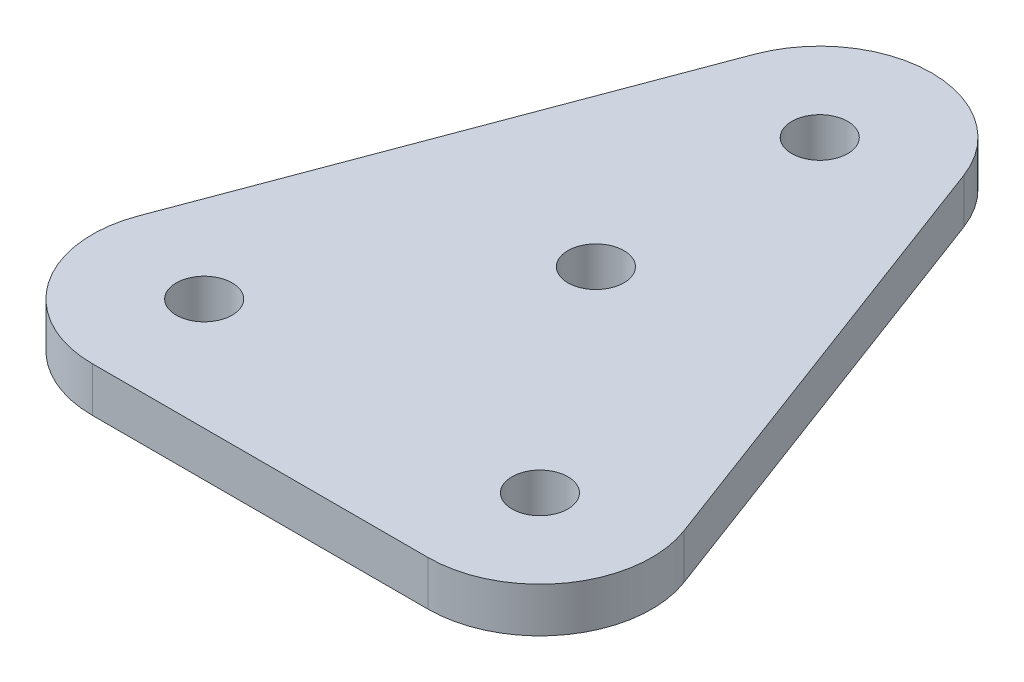
ISO-10303-21;
HEADER;
FILE_DESCRIPTION(('STEP AP214'),'2;1');
FILE_NAME('part.step','',(''),(''),'','','');
FILE_SCHEMA(('AUTOMOTIVE_DESIGN { 1 0 10303 214 1 1 1 1 }'));
ENDSEC;
DATA;
#1=APPLICATION_CONTEXT('core data for automotive mechanical design processes');
#2=APPLICATION_PROTOCOL_DEFINITION('international standard','automotive_design',2000,#1);
#3=PRODUCT_CONTEXT('',#1,'mechanical');
#4=PRODUCT('Part','Part','',(#3));
#5=PRODUCT_RELATED_PRODUCT_CATEGORY('part','',(#4));
#6=PRODUCT_DEFINITION_FORMATION('','',#4);
#7=PRODUCT_DEFINITION_CONTEXT('part definition',#1,'design');
#8=PRODUCT_DEFINITION('design','',#6,#7);
#9=PRODUCT_DEFINITION_SHAPE('','',#8);
#10=(LENGTH_UNIT() NAMED_UNIT(*) SI_UNIT(.MILLI.,.METRE.));
#11=(NAMED_UNIT(*) PLANE_ANGLE_UNIT() SI_UNIT($,.RADIAN.));
#12=(NAMED_UNIT(*) SI_UNIT($,.STERADIAN.) SOLID_ANGLE_UNIT());
#13=UNCERTAINTY_MEASURE_WITH_UNIT(LENGTH_MEASURE(1.E-05),#10,'distance_accuracy_value','');
#14=(GEOMETRIC_REPRESENTATION_CONTEXT(3) GLOBAL_UNCERTAINTY_ASSIGNED_CONTEXT((#13)) GLOBAL_UNIT_ASSIGNED_CONTEXT((#10,
#11,#12)) REPRESENTATION_CONTEXT('',''));
#15=CARTESIAN_POINT('',(0.,0.,0.));
#16=DIRECTION('',(0.,0.,1.));
#17=DIRECTION('',(1.,0.,0.));
#18=AXIS2_PLACEMENT_3D('',#15,#16,#17);
#19=CARTESIAN_POINT('',(-15.,4.,0.));
#20=DIRECTION('',(0.,1.,0.));
#21=DIRECTION('',(0.,0.,1.));
#22=AXIS2_PLACEMENT_3D('',#19,#20,#21);
#23=PLANE('',#22);
#24=CARTESIAN_POINT('',(0.,4.,-20.));
#25=DIRECTION('',(0.,1.,0.));
#26=DIRECTION('',(0.,0.,1.));
#27=AXIS2_PLACEMENT_3D('',#24,#25,#26);
#28=CIRCLE('',#27,2.5);
#29=CARTESIAN_POINT('',(0.,4.,-17.5));
#30=VERTEX_POINT('',#29);
#31=EDGE_CURVE('E190',#30,#30,#28,.T.);
#32=ORIENTED_EDGE('',*,*,#31,.F.);
#33=EDGE_LOOP('',(#32));
#34=FACE_BOUND('',#33,.T.);
#35=CARTESIAN_POINT('',(15.,4.,0.));
#36=DIRECTION('',(0.,1.,0.));
#37=DIRECTION('',(0.,0.,1.));
#38=AXIS2_PLACEMENT_3D('',#35,#36,#37);
#39=CIRCLE('',#38,2.5);
#40=CARTESIAN_POINT('',(15.,4.,2.5));
#41=VERTEX_POINT('',#40);
#42=EDGE_CURVE('E123',#41,#41,#39,.T.);
#43=ORIENTED_EDGE('',*,*,#42,.F.);
#44=EDGE_LOOP('',(#43));
#45=FACE_BOUND('',#44,.T.);
#46=CARTESIAN_POINT('',(-15.,4.,0.));
#47=DIRECTION('',(0.,1.,0.));
#48=DIRECTION('',(0.,0.,1.));
#49=AXIS2_PLACEMENT_3D('',#46,#47,#48);
#50=CIRCLE('',#49,9.99999999999999);
#51=CARTESIAN_POINT('',(-24.3632917756904,4.,-3.51123441588391));
#52=VERTEX_POINT('',#51);
#53=CARTESIAN_POINT('',(-15.,4.,10.));
#54=VERTEX_POINT('',#53);
#55=EDGE_CURVE('E130',#52,#54,#50,.T.);
#56=ORIENTED_EDGE('',*,*,#55,.T.);
#57=DIRECTION('',(1.,0.,0.));
#58=VECTOR('',#57,1.);
#59=CARTESIAN_POINT('',(-15.,4.,10.));
#60=LINE('',#59,#58);
#61=CARTESIAN_POINT('',(15.,4.,10.));
#62=VERTEX_POINT('',#61);
#63=EDGE_CURVE('E88',#54,#62,#60,.T.);
#64=ORIENTED_EDGE('',*,*,#63,.T.);
#65=CARTESIAN_POINT('',(15.,4.,0.));
#66=DIRECTION('',(0.,1.,0.));
#67=DIRECTION('',(0.,0.,1.));
#68=AXIS2_PLACEMENT_3D('',#65,#66,#67);
#69=CIRCLE('',#68,9.99999999999999);
#70=CARTESIAN_POINT('',(24.3632917756904,4.,-3.51123441588392));
#71=VERTEX_POINT('',#70);
#72=EDGE_CURVE('E101',#62,#71,#69,.T.);
#73=ORIENTED_EDGE('',*,*,#72,.T.);
#74=DIRECTION('',(-0.351123441588392,0.,-0.936329177569045));
#75=VECTOR('',#74,1.);
#76=CARTESIAN_POINT('',(9.36329177569044,4.,-43.5112344158839));
#77=LINE('',#76,#75);
#78=CARTESIAN_POINT('',(9.36329177569044,4.,-43.5112344158839));
#79=VERTEX_POINT('',#78);
#80=EDGE_CURVE('E95',#71,#79,#77,.T.);
#81=ORIENTED_EDGE('',*,*,#80,.T.);
#82=CARTESIAN_POINT('',(0.,4.,-40.));
#83=DIRECTION('',(0.,1.,0.));
#84=DIRECTION('',(0.,0.,1.));
#85=AXIS2_PLACEMENT_3D('',#82,#83,#84);
#86=CIRCLE('',#85,9.99999999999999);
#87=CARTESIAN_POINT('',(-9.36329177569044,4.,-43.5112344158839));
#88=VERTEX_POINT('',#87);
#89=EDGE_CURVE('E99',#79,#88,#86,.T.);
#90=ORIENTED_EDGE('',*,*,#89,.T.);
#91=DIRECTION('',(-0.351123441588391,0.,0.936329177569045));
#92=VECTOR('',#91,1.);
#93=CARTESIAN_POINT('',(-9.36329177569045,4.,-43.5112344158839));
#94=LINE('',#93,#92);
#95=EDGE_CURVE('E51',#88,#52,#94,.T.);
#96=ORIENTED_EDGE('',*,*,#95,.T.);
#97=EDGE_LOOP('',(#56,#64,#73,#81,#90,#96));
#98=FACE_BOUND('',#97,.T.);
#99=CARTESIAN_POINT('',(-15.,4.,0.));
#100=DIRECTION('',(0.,1.,0.));
#101=DIRECTION('',(0.,0.,-1.));
#102=AXIS2_PLACEMENT_3D('',#99,#100,#101);
#103=CIRCLE('',#102,2.5);
#104=CARTESIAN_POINT('',(-15.,4.,-2.5));
#105=VERTEX_POINT('',#104);
#106=EDGE_CURVE('E196',#105,#105,#103,.T.);
#107=ORIENTED_EDGE('',*,*,#106,.F.);
#108=EDGE_LOOP('',(#107));
#109=FACE_BOUND('',#108,.T.);
#110=CARTESIAN_POINT('',(0.,4.,-40.));
#111=DIRECTION('',(0.,1.,0.));
#112=DIRECTION('',(0.,0.,1.));
#113=AXIS2_PLACEMENT_3D('',#110,#111,#112);
#114=CIRCLE('',#113,2.5);
#115=CARTESIAN_POINT('',(0.,4.,-37.5));
#116=VERTEX_POINT('',#115);
#117=EDGE_CURVE('E181',#116,#116,#114,.T.);
#118=ORIENTED_EDGE('',*,*,#117,.F.);
#119=EDGE_LOOP('',(#118));
#120=FACE_BOUND('',#119,.T.);
#121=ADVANCED_FACE('F34',(#34,#45,#98,#109,#120),#23,.T.);
#122=CARTESIAN_POINT('',(-15.,0.,0.));
#123=DIRECTION('',(0.,1.,0.));
#124=DIRECTION('',(0.,0.,1.));
#125=AXIS2_PLACEMENT_3D('',#122,#123,#124);
#126=PLANE('',#125);
#127=CARTESIAN_POINT('',(-15.,0.,0.));
#128=DIRECTION('',(0.,1.,0.));
#129=DIRECTION('',(0.,0.,1.));
#130=AXIS2_PLACEMENT_3D('',#127,#128,#129);
#131=CIRCLE('',#130,9.99999999999999);
#132=CARTESIAN_POINT('',(-24.3632917756904,0.,-3.51123441588391));
#133=VERTEX_POINT('',#132);
#134=CARTESIAN_POINT('',(-15.,0.,10.));
#135=VERTEX_POINT('',#134);
#136=EDGE_CURVE('E119',#133,#135,#131,.T.);
#137=ORIENTED_EDGE('',*,*,#136,.F.);
#138=DIRECTION('',(-0.351123441588391,0.,0.936329177569045));
#139=VECTOR('',#138,1.);
#140=CARTESIAN_POINT('',(-9.36329177569045,0.,-43.5112344158839));
#141=LINE('',#140,#139);
#142=CARTESIAN_POINT('',(-9.36329177569044,0.,-43.5112344158839));
#143=VERTEX_POINT('',#142);
#144=EDGE_CURVE('E80',#143,#133,#141,.T.);
#145=ORIENTED_EDGE('',*,*,#144,.F.);
#146=CARTESIAN_POINT('',(0.,0.,-40.));
#147=DIRECTION('',(0.,1.,0.));
#148=DIRECTION('',(0.,0.,1.));
#149=AXIS2_PLACEMENT_3D('',#146,#147,#148);
#150=CIRCLE('',#149,9.99999999999999);
#151=CARTESIAN_POINT('',(9.36329177569044,0.,-43.5112344158839));
#152=VERTEX_POINT('',#151);
#153=EDGE_CURVE('E74',#152,#143,#150,.T.);
#154=ORIENTED_EDGE('',*,*,#153,.F.);
#155=DIRECTION('',(-0.351123441588392,0.,-0.936329177569045));
#156=VECTOR('',#155,1.);
#157=CARTESIAN_POINT('',(9.36329177569044,0.,-43.5112344158839));
#158=LINE('',#157,#156);
#159=CARTESIAN_POINT('',(24.3632917756904,0.,-3.51123441588392));
#160=VERTEX_POINT('',#159);
#161=EDGE_CURVE('E109',#160,#152,#158,.T.);
#162=ORIENTED_EDGE('',*,*,#161,.F.);
#163=CARTESIAN_POINT('',(15.,0.,0.));
#164=DIRECTION('',(0.,1.,0.));
#165=DIRECTION('',(0.,0.,1.));
#166=AXIS2_PLACEMENT_3D('',#163,#164,#165);
#167=CIRCLE('',#166,9.99999999999999);
#168=CARTESIAN_POINT('',(15.,0.,10.));
#169=VERTEX_POINT('',#168);
#170=EDGE_CURVE('E125',#169,#160,#167,.T.);
#171=ORIENTED_EDGE('',*,*,#170,.F.);
#172=DIRECTION('',(1.,0.,0.));
#173=VECTOR('',#172,1.);
#174=CARTESIAN_POINT('',(-15.,0.,10.));
#175=LINE('',#174,#173);
#176=EDGE_CURVE('E122',#135,#169,#175,.T.);
#177=ORIENTED_EDGE('',*,*,#176,.F.);
#178=EDGE_LOOP('',(#137,#145,#154,#162,#171,#177));
#179=FACE_BOUND('',#178,.T.);
#180=CARTESIAN_POINT('',(15.,0.,0.));
#181=DIRECTION('',(0.,1.,0.));
#182=DIRECTION('',(0.,0.,1.));
#183=AXIS2_PLACEMENT_3D('',#180,#181,#182);
#184=CIRCLE('',#183,2.5);
#185=CARTESIAN_POINT('',(15.,0.,2.5));
#186=VERTEX_POINT('',#185);
#187=EDGE_CURVE('E199',#186,#186,#184,.T.);
#188=ORIENTED_EDGE('',*,*,#187,.T.);
#189=EDGE_LOOP('',(#188));
#190=FACE_BOUND('',#189,.T.);
#191=CARTESIAN_POINT('',(-15.,0.,0.));
#192=DIRECTION('',(0.,1.,0.));
#193=DIRECTION('',(0.,0.,-1.));
#194=AXIS2_PLACEMENT_3D('',#191,#192,#193);
#195=CIRCLE('',#194,2.5);
#196=CARTESIAN_POINT('',(-15.,0.,-2.5));
#197=VERTEX_POINT('',#196);
#198=EDGE_CURVE('E193',#197,#197,#195,.T.);
#199=ORIENTED_EDGE('',*,*,#198,.T.);
#200=EDGE_LOOP('',(#199));
#201=FACE_BOUND('',#200,.T.);
#202=CARTESIAN_POINT('',(0.,0.,-20.));
#203=DIRECTION('',(0.,1.,0.));
#204=DIRECTION('',(0.,0.,1.));
#205=AXIS2_PLACEMENT_3D('',#202,#203,#204);
#206=CIRCLE('',#205,2.5);
#207=CARTESIAN_POINT('',(0.,0.,-17.5));
#208=VERTEX_POINT('',#207);
#209=EDGE_CURVE('E187',#208,#208,#206,.T.);
#210=ORIENTED_EDGE('',*,*,#209,.T.);
#211=EDGE_LOOP('',(#210));
#212=FACE_BOUND('',#211,.T.);
#213=CARTESIAN_POINT('',(0.,0.,-40.));
#214=DIRECTION('',(0.,1.,0.));
#215=DIRECTION('',(0.,0.,1.));
#216=AXIS2_PLACEMENT_3D('',#213,#214,#215);
#217=CIRCLE('',#216,2.5);
#218=CARTESIAN_POINT('',(0.,0.,-37.5));
#219=VERTEX_POINT('',#218);
#220=EDGE_CURVE('E184',#219,#219,#217,.T.);
#221=ORIENTED_EDGE('',*,*,#220,.T.);
#222=EDGE_LOOP('',(#221));
#223=FACE_BOUND('',#222,.T.);
#224=ADVANCED_FACE('F139',(#179,#190,#201,#212,#223),#126,.F.);
#225=CARTESIAN_POINT('',(-15.,4.,0.));
#226=DIRECTION('',(0.,-1.,0.));
#227=DIRECTION('',(0.,0.,-1.));
#228=AXIS2_PLACEMENT_3D('',#225,#226,#227);
#229=CYLINDRICAL_SURFACE('',#228,9.99999999999999);
#230=ORIENTED_EDGE('',*,*,#136,.T.);
#231=DIRECTION('',(0.,-1.,0.));
#232=VECTOR('',#231,1.);
#233=CARTESIAN_POINT('',(-15.,4.,10.));
#234=LINE('',#233,#232);
#235=EDGE_CURVE('E11',#54,#135,#234,.T.);
#236=ORIENTED_EDGE('',*,*,#235,.F.);
#237=ORIENTED_EDGE('',*,*,#55,.F.);
#238=DIRECTION('',(0.,-1.,0.));
#239=VECTOR('',#238,1.);
#240=CARTESIAN_POINT('',(-24.3632917756904,4.,-3.51123441588391));
#241=LINE('',#240,#239);
#242=EDGE_CURVE('E115',#52,#133,#241,.T.);
#243=ORIENTED_EDGE('',*,*,#242,.T.);
#244=EDGE_LOOP('',(#230,#236,#237,#243));
#245=FACE_BOUND('',#244,.T.);
#246=ADVANCED_FACE('F36',(#245),#229,.T.);
#247=CARTESIAN_POINT('',(-15.,4.,10.));
#248=DIRECTION('',(0.,0.,-1.));
#249=DIRECTION('',(-1.,0.,0.));
#250=AXIS2_PLACEMENT_3D('',#247,#248,#249);
#251=PLANE('',#250);
#252=ORIENTED_EDGE('',*,*,#176,.T.);
#253=DIRECTION('',(0.,-1.,0.));
#254=VECTOR('',#253,1.);
#255=CARTESIAN_POINT('',(15.,4.,10.));
#256=LINE('',#255,#254);
#257=EDGE_CURVE('E43',#62,#169,#256,.T.);
#258=ORIENTED_EDGE('',*,*,#257,.F.);
#259=ORIENTED_EDGE('',*,*,#63,.F.);
#260=ORIENTED_EDGE('',*,*,#235,.T.);
#261=EDGE_LOOP('',(#252,#258,#259,#260));
#262=FACE_BOUND('',#261,.T.);
#263=ADVANCED_FACE('F257',(#262),#251,.F.);
#264=CARTESIAN_POINT('',(15.,4.,0.));
#265=DIRECTION('',(0.,-1.,0.));
#266=DIRECTION('',(0.,0.,-1.));
#267=AXIS2_PLACEMENT_3D('',#264,#265,#266);
#268=CYLINDRICAL_SURFACE('',#267,9.99999999999999);
#269=ORIENTED_EDGE('',*,*,#170,.T.);
#270=DIRECTION('',(0.,-1.,0.));
#271=VECTOR('',#270,1.);
#272=CARTESIAN_POINT('',(24.3632917756904,4.,-3.51123441588392));
#273=LINE('',#272,#271);
#274=EDGE_CURVE('E110',#71,#160,#273,.T.);
#275=ORIENTED_EDGE('',*,*,#274,.F.);
#276=ORIENTED_EDGE('',*,*,#72,.F.);
#277=ORIENTED_EDGE('',*,*,#257,.T.);
#278=EDGE_LOOP('',(#269,#275,#276,#277));
#279=FACE_BOUND('',#278,.T.);
#280=ADVANCED_FACE('F136',(#279),#268,.T.);
#281=CARTESIAN_POINT('',(9.36329177569044,4.,-43.5112344158839));
#282=DIRECTION('',(-0.936329177569045,0.,0.351123441588392));
#283=DIRECTION('',(0.351123441588392,0.,0.936329177569045));
#284=AXIS2_PLACEMENT_3D('',#281,#282,#283);
#285=PLANE('',#284);
#286=ORIENTED_EDGE('',*,*,#161,.T.);
#287=DIRECTION('',(0.,-1.,0.));
#288=VECTOR('',#287,1.);
#289=CARTESIAN_POINT('',(9.36329177569044,4.,-43.5112344158839));
#290=LINE('',#289,#288);
#291=EDGE_CURVE('E106',#79,#152,#290,.T.);
#292=ORIENTED_EDGE('',*,*,#291,.F.);
#293=ORIENTED_EDGE('',*,*,#80,.F.);
#294=ORIENTED_EDGE('',*,*,#274,.T.);
#295=EDGE_LOOP('',(#286,#292,#293,#294));
#296=FACE_BOUND('',#295,.T.);
#297=ADVANCED_FACE('F107',(#296),#285,.F.);
#298=CARTESIAN_POINT('',(0.,4.,-40.));
#299=DIRECTION('',(0.,-1.,0.));
#300=DIRECTION('',(0.,0.,-1.));
#301=AXIS2_PLACEMENT_3D('',#298,#299,#300);
#302=CYLINDRICAL_SURFACE('',#301,9.99999999999999);
#303=ORIENTED_EDGE('',*,*,#153,.T.);
#304=DIRECTION('',(0.,-1.,0.));
#305=VECTOR('',#304,1.);
#306=CARTESIAN_POINT('',(-9.36329177569044,4.,-43.5112344158839));
#307=LINE('',#306,#305);
#308=EDGE_CURVE('E111',#88,#143,#307,.T.);
#309=ORIENTED_EDGE('',*,*,#308,.F.);
#310=ORIENTED_EDGE('',*,*,#89,.F.);
#311=ORIENTED_EDGE('',*,*,#291,.T.);
#312=EDGE_LOOP('',(#303,#309,#310,#311));
#313=FACE_BOUND('',#312,.T.);
#314=ADVANCED_FACE('F113',(#313),#302,.T.);
#315=CARTESIAN_POINT('',(-9.36329177569045,4.,-43.5112344158839));
#316=DIRECTION('',(0.936329177569045,0.,0.351123441588391));
#317=DIRECTION('',(0.351123441588391,0.,-0.936329177569045));
#318=AXIS2_PLACEMENT_3D('',#315,#316,#317);
#319=PLANE('',#318);
#320=ORIENTED_EDGE('',*,*,#144,.T.);
#321=ORIENTED_EDGE('',*,*,#242,.F.);
#322=ORIENTED_EDGE('',*,*,#95,.F.);
#323=ORIENTED_EDGE('',*,*,#308,.T.);
#324=EDGE_LOOP('',(#320,#321,#322,#323));
#325=FACE_BOUND('',#324,.T.);
#326=ADVANCED_FACE('F144',(#325),#319,.F.);
#327=CARTESIAN_POINT('',(15.,4.,0.));
#328=DIRECTION('',(0.,-1.,0.));
#329=DIRECTION('',(0.,0.,-1.));
#330=AXIS2_PLACEMENT_3D('',#327,#328,#329);
#331=CYLINDRICAL_SURFACE('',#330,2.5);
#332=ORIENTED_EDGE('',*,*,#42,.T.);
#333=EDGE_LOOP('',(#332));
#334=FACE_BOUND('',#333,.T.);
#335=ORIENTED_EDGE('',*,*,#187,.F.);
#336=EDGE_LOOP('',(#335));
#337=FACE_BOUND('',#336,.T.);
#338=ADVANCED_FACE('F146',(#334,#337),#331,.F.);
#339=CARTESIAN_POINT('',(-15.,4.,0.));
#340=DIRECTION('',(0.,-1.,0.));
#341=DIRECTION('',(0.,0.,-1.));
#342=AXIS2_PLACEMENT_3D('',#339,#340,#341);
#343=CYLINDRICAL_SURFACE('',#342,2.5);
#344=ORIENTED_EDGE('',*,*,#106,.T.);
#345=EDGE_LOOP('',(#344));
#346=FACE_BOUND('',#345,.T.);
#347=ORIENTED_EDGE('',*,*,#198,.F.);
#348=EDGE_LOOP('',(#347));
#349=FACE_BOUND('',#348,.T.);
#350=ADVANCED_FACE('F152',(#346,#349),#343,.F.);
#351=CARTESIAN_POINT('',(0.,4.,-20.));
#352=DIRECTION('',(0.,-1.,0.));
#353=DIRECTION('',(0.,0.,-1.));
#354=AXIS2_PLACEMENT_3D('',#351,#352,#353);
#355=CYLINDRICAL_SURFACE('',#354,2.5);
#356=ORIENTED_EDGE('',*,*,#31,.T.);
#357=EDGE_LOOP('',(#356));
#358=FACE_BOUND('',#357,.T.);
#359=ORIENTED_EDGE('',*,*,#209,.F.);
#360=EDGE_LOOP('',(#359));
#361=FACE_BOUND('',#360,.T.);
#362=ADVANCED_FACE('F168',(#358,#361),#355,.F.);
#363=CARTESIAN_POINT('',(0.,4.,-40.));
#364=DIRECTION('',(0.,-1.,0.));
#365=DIRECTION('',(0.,0.,-1.));
#366=AXIS2_PLACEMENT_3D('',#363,#364,#365);
#367=CYLINDRICAL_SURFACE('',#366,2.5);
#368=ORIENTED_EDGE('',*,*,#117,.T.);
#369=EDGE_LOOP('',(#368));
#370=FACE_BOUND('',#369,.T.);
#371=ORIENTED_EDGE('',*,*,#220,.F.);
#372=EDGE_LOOP('',(#371));
#373=FACE_BOUND('',#372,.T.);
#374=ADVANCED_FACE('F172',(#370,#373),#367,.F.);
#375=CLOSED_SHELL('',(#121,#224,#246,#263,#280,#297,#314,#326,#338,#350,#362,#374));
#376=MANIFOLD_SOLID_BREP('B2',#375);
#377=ADVANCED_BREP_SHAPE_REPRESENTATION('',(#18,#376),#14);
#378=SHAPE_DEFINITION_REPRESENTATION(#9,#377);
ENDSEC;
END-ISO-10303-21;
